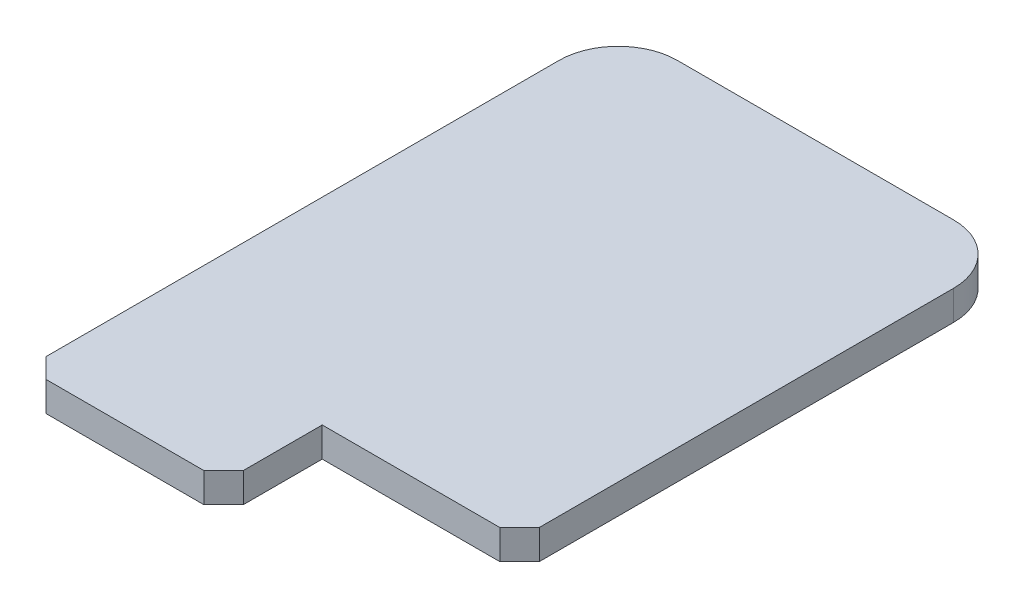
ISO-10303-21;
HEADER;
FILE_DESCRIPTION(('STEP AP214'),'2;1');
FILE_NAME('part.step','',(''),(''),'','','');
FILE_SCHEMA(('AUTOMOTIVE_DESIGN { 1 0 10303 214 1 1 1 1 }'));
ENDSEC;
DATA;
#1=APPLICATION_CONTEXT('core data for automotive mechanical design processes');
#2=APPLICATION_PROTOCOL_DEFINITION('international standard','automotive_design',2000,#1);
#3=PRODUCT_CONTEXT('',#1,'mechanical');
#4=PRODUCT('Part','Part','',(#3));
#5=PRODUCT_RELATED_PRODUCT_CATEGORY('part','',(#4));
#6=PRODUCT_DEFINITION_FORMATION('','',#4);
#7=PRODUCT_DEFINITION_CONTEXT('part definition',#1,'design');
#8=PRODUCT_DEFINITION('design','',#6,#7);
#9=PRODUCT_DEFINITION_SHAPE('','',#8);
#10=(LENGTH_UNIT() NAMED_UNIT(*) SI_UNIT(.MILLI.,.METRE.));
#11=(NAMED_UNIT(*) PLANE_ANGLE_UNIT() SI_UNIT($,.RADIAN.));
#12=(NAMED_UNIT(*) SI_UNIT($,.STERADIAN.) SOLID_ANGLE_UNIT());
#13=UNCERTAINTY_MEASURE_WITH_UNIT(LENGTH_MEASURE(1.E-05),#10,'distance_accuracy_value','');
#14=(GEOMETRIC_REPRESENTATION_CONTEXT(3) GLOBAL_UNCERTAINTY_ASSIGNED_CONTEXT((#13)) GLOBAL_UNIT_ASSIGNED_CONTEXT((#10,
#11,#12)) REPRESENTATION_CONTEXT('',''));
#15=CARTESIAN_POINT('',(0.,0.,0.));
#16=DIRECTION('',(0.,0.,1.));
#17=DIRECTION('',(1.,0.,0.));
#18=AXIS2_PLACEMENT_3D('',#15,#16,#17);
#19=CARTESIAN_POINT('',(-10.,1.5,0.));
#20=DIRECTION('',(0.,0.,-1.));
#21=DIRECTION('',(-1.,0.,0.));
#22=AXIS2_PLACEMENT_3D('',#19,#20,#21);
#23=PLANE('',#22);
#24=DIRECTION('',(1.,0.,0.));
#25=VECTOR('',#24,1.);
#26=CARTESIAN_POINT('',(-10.,0.,0.));
#27=LINE('',#26,#25);
#28=CARTESIAN_POINT('',(-9.,0.,0.));
#29=VERTEX_POINT('',#28);
#30=CARTESIAN_POINT('',(-1.00000000000001,0.,0.));
#31=VERTEX_POINT('',#30);
#32=EDGE_CURVE('E149',#29,#31,#27,.T.);
#33=ORIENTED_EDGE('',*,*,#32,.T.);
#34=DIRECTION('',(0.,1.,0.));
#35=VECTOR('',#34,1.);
#36=CARTESIAN_POINT('',(-1.00000000000001,1.5,0.));
#37=LINE('',#36,#35);
#38=CARTESIAN_POINT('',(-1.00000000000001,1.5,0.));
#39=VERTEX_POINT('',#38);
#40=EDGE_CURVE('E41',#31,#39,#37,.T.);
#41=ORIENTED_EDGE('',*,*,#40,.T.);
#42=DIRECTION('',(1.,0.,0.));
#43=VECTOR('',#42,1.);
#44=CARTESIAN_POINT('',(-10.,1.5,0.));
#45=LINE('',#44,#43);
#46=CARTESIAN_POINT('',(-9.,1.5,0.));
#47=VERTEX_POINT('',#46);
#48=EDGE_CURVE('E123',#47,#39,#45,.T.);
#49=ORIENTED_EDGE('',*,*,#48,.F.);
#50=DIRECTION('',(0.,-1.,0.));
#51=VECTOR('',#50,1.);
#52=CARTESIAN_POINT('',(-9.,1.5,0.));
#53=LINE('',#52,#51);
#54=EDGE_CURVE('E198',#47,#29,#53,.T.);
#55=ORIENTED_EDGE('',*,*,#54,.T.);
#56=EDGE_LOOP('',(#33,#41,#49,#55));
#57=FACE_BOUND('',#56,.T.);
#58=ADVANCED_FACE('F33',(#57),#23,.F.);
#59=CARTESIAN_POINT('',(0.,1.5,0.));
#60=DIRECTION('',(-1.,0.,0.));
#61=DIRECTION('',(0.,0.,1.));
#62=AXIS2_PLACEMENT_3D('',#59,#60,#61);
#63=PLANE('',#62);
#64=DIRECTION('',(0.,0.,-1.));
#65=VECTOR('',#64,1.);
#66=CARTESIAN_POINT('',(0.,1.5,0.));
#67=LINE('',#66,#65);
#68=CARTESIAN_POINT('',(0.,1.5,-1.));
#69=VERTEX_POINT('',#68);
#70=CARTESIAN_POINT('',(0.,1.5,-5.));
#71=VERTEX_POINT('',#70);
#72=EDGE_CURVE('E114',#69,#71,#67,.T.);
#73=ORIENTED_EDGE('',*,*,#72,.F.);
#74=DIRECTION('',(0.,-1.,0.));
#75=VECTOR('',#74,1.);
#76=CARTESIAN_POINT('',(0.,1.5,-1.));
#77=LINE('',#76,#75);
#78=CARTESIAN_POINT('',(0.,0.,-1.));
#79=VERTEX_POINT('',#78);
#80=EDGE_CURVE('E196',#69,#79,#77,.T.);
#81=ORIENTED_EDGE('',*,*,#80,.T.);
#82=DIRECTION('',(0.,0.,-1.));
#83=VECTOR('',#82,1.);
#84=CARTESIAN_POINT('',(0.,0.,0.));
#85=LINE('',#84,#83);
#86=CARTESIAN_POINT('',(0.,0.,-5.));
#87=VERTEX_POINT('',#86);
#88=EDGE_CURVE('E129',#79,#87,#85,.T.);
#89=ORIENTED_EDGE('',*,*,#88,.T.);
#90=DIRECTION('',(0.,-1.,0.));
#91=VECTOR('',#90,1.);
#92=CARTESIAN_POINT('',(0.,1.5,-5.));
#93=LINE('',#92,#91);
#94=EDGE_CURVE('E126',#71,#87,#93,.T.);
#95=ORIENTED_EDGE('',*,*,#94,.F.);
#96=EDGE_LOOP('',(#73,#81,#89,#95));
#97=FACE_BOUND('',#96,.T.);
#98=ADVANCED_FACE('F127',(#97),#63,.F.);
#99=CARTESIAN_POINT('',(0.,1.5,-5.));
#100=DIRECTION('',(0.,0.,-1.));
#101=DIRECTION('',(-1.,0.,0.));
#102=AXIS2_PLACEMENT_3D('',#99,#100,#101);
#103=PLANE('',#102);
#104=DIRECTION('',(1.,0.,0.));
#105=VECTOR('',#104,1.);
#106=CARTESIAN_POINT('',(0.,0.,-5.));
#107=LINE('',#106,#105);
#108=CARTESIAN_POINT('',(9.,0.,-5.));
#109=VERTEX_POINT('',#108);
#110=EDGE_CURVE('E152',#87,#109,#107,.T.);
#111=ORIENTED_EDGE('',*,*,#110,.T.);
#112=DIRECTION('',(0.,1.,0.));
#113=VECTOR('',#112,1.);
#114=CARTESIAN_POINT('',(9.,1.5,-5.));
#115=LINE('',#114,#113);
#116=CARTESIAN_POINT('',(9.,1.5,-5.));
#117=VERTEX_POINT('',#116);
#118=EDGE_CURVE('E138',#109,#117,#115,.T.);
#119=ORIENTED_EDGE('',*,*,#118,.T.);
#120=DIRECTION('',(1.,0.,0.));
#121=VECTOR('',#120,1.);
#122=CARTESIAN_POINT('',(0.,1.5,-5.));
#123=LINE('',#122,#121);
#124=EDGE_CURVE('E118',#71,#117,#123,.T.);
#125=ORIENTED_EDGE('',*,*,#124,.F.);
#126=ORIENTED_EDGE('',*,*,#94,.T.);
#127=EDGE_LOOP('',(#111,#119,#125,#126));
#128=FACE_BOUND('',#127,.T.);
#129=ADVANCED_FACE('F136',(#128),#103,.F.);
#130=CARTESIAN_POINT('',(10.,1.5,-5.));
#131=DIRECTION('',(-1.,0.,0.));
#132=DIRECTION('',(0.,0.,1.));
#133=AXIS2_PLACEMENT_3D('',#130,#131,#132);
#134=PLANE('',#133);
#135=DIRECTION('',(0.,0.,-1.));
#136=VECTOR('',#135,1.);
#137=CARTESIAN_POINT('',(10.,1.5,-5.));
#138=LINE('',#137,#136);
#139=CARTESIAN_POINT('',(10.,1.5,-6.));
#140=VERTEX_POINT('',#139);
#141=CARTESIAN_POINT('',(10.,1.5,-27.));
#142=VERTEX_POINT('',#141);
#143=EDGE_CURVE('E139',#140,#142,#138,.T.);
#144=ORIENTED_EDGE('',*,*,#143,.F.);
#145=DIRECTION('',(0.,-1.,0.));
#146=VECTOR('',#145,1.);
#147=CARTESIAN_POINT('',(10.,1.5,-6.));
#148=LINE('',#147,#146);
#149=CARTESIAN_POINT('',(10.,0.,-6.));
#150=VERTEX_POINT('',#149);
#151=EDGE_CURVE('E181',#140,#150,#148,.T.);
#152=ORIENTED_EDGE('',*,*,#151,.T.);
#153=DIRECTION('',(0.,0.,-1.));
#154=VECTOR('',#153,1.);
#155=CARTESIAN_POINT('',(10.,0.,-5.));
#156=LINE('',#155,#154);
#157=CARTESIAN_POINT('',(10.,0.,-27.));
#158=VERTEX_POINT('',#157);
#159=EDGE_CURVE('E154',#150,#158,#156,.T.);
#160=ORIENTED_EDGE('',*,*,#159,.T.);
#161=DIRECTION('',(0.,-1.,0.));
#162=VECTOR('',#161,1.);
#163=CARTESIAN_POINT('',(10.,1.5,-27.));
#164=LINE('',#163,#162);
#165=EDGE_CURVE('E171',#158,#142,#164,.F.);
#166=ORIENTED_EDGE('',*,*,#165,.T.);
#167=EDGE_LOOP('',(#144,#152,#160,#166));
#168=FACE_BOUND('',#167,.T.);
#169=ADVANCED_FACE('F251',(#168),#134,.F.);
#170=CARTESIAN_POINT('',(10.,1.5,-30.));
#171=DIRECTION('',(0.,0.,1.));
#172=DIRECTION('',(1.,0.,0.));
#173=AXIS2_PLACEMENT_3D('',#170,#171,#172);
#174=PLANE('',#173);
#175=DIRECTION('',(-1.,0.,0.));
#176=VECTOR('',#175,1.);
#177=CARTESIAN_POINT('',(10.,1.5,-30.));
#178=LINE('',#177,#176);
#179=CARTESIAN_POINT('',(7.,1.5,-30.));
#180=VERTEX_POINT('',#179);
#181=CARTESIAN_POINT('',(-7.,1.5,-30.));
#182=VERTEX_POINT('',#181);
#183=EDGE_CURVE('E141',#180,#182,#178,.T.);
#184=ORIENTED_EDGE('',*,*,#183,.F.);
#185=DIRECTION('',(0.,-1.,0.));
#186=VECTOR('',#185,1.);
#187=CARTESIAN_POINT('',(7.,1.5,-30.));
#188=LINE('',#187,#186);
#189=CARTESIAN_POINT('',(7.,0.,-30.));
#190=VERTEX_POINT('',#189);
#191=EDGE_CURVE('E163',#180,#190,#188,.T.);
#192=ORIENTED_EDGE('',*,*,#191,.T.);
#193=DIRECTION('',(-1.,0.,0.));
#194=VECTOR('',#193,1.);
#195=CARTESIAN_POINT('',(10.,0.,-30.));
#196=LINE('',#195,#194);
#197=CARTESIAN_POINT('',(-7.,0.,-30.));
#198=VERTEX_POINT('',#197);
#199=EDGE_CURVE('E156',#190,#198,#196,.T.);
#200=ORIENTED_EDGE('',*,*,#199,.T.);
#201=DIRECTION('',(0.,-1.,0.));
#202=VECTOR('',#201,1.);
#203=CARTESIAN_POINT('',(-7.,1.5,-30.));
#204=LINE('',#203,#202);
#205=EDGE_CURVE('E133',#198,#182,#204,.F.);
#206=ORIENTED_EDGE('',*,*,#205,.T.);
#207=EDGE_LOOP('',(#184,#192,#200,#206));
#208=FACE_BOUND('',#207,.T.);
#209=ADVANCED_FACE('F245',(#208),#174,.F.);
#210=CARTESIAN_POINT('',(-10.,1.5,-30.));
#211=DIRECTION('',(1.,0.,0.));
#212=DIRECTION('',(0.,0.,-1.));
#213=AXIS2_PLACEMENT_3D('',#210,#211,#212);
#214=PLANE('',#213);
#215=DIRECTION('',(0.,0.,1.));
#216=VECTOR('',#215,1.);
#217=CARTESIAN_POINT('',(-10.,0.,-30.));
#218=LINE('',#217,#216);
#219=CARTESIAN_POINT('',(-10.,0.,-27.));
#220=VERTEX_POINT('',#219);
#221=CARTESIAN_POINT('',(-10.,0.,-1.00000000000001));
#222=VERTEX_POINT('',#221);
#223=EDGE_CURVE('E159',#220,#222,#218,.T.);
#224=ORIENTED_EDGE('',*,*,#223,.T.);
#225=DIRECTION('',(0.,1.,0.));
#226=VECTOR('',#225,1.);
#227=CARTESIAN_POINT('',(-10.,1.5,-1.00000000000001));
#228=LINE('',#227,#226);
#229=CARTESIAN_POINT('',(-10.,1.5,-1.00000000000001));
#230=VERTEX_POINT('',#229);
#231=EDGE_CURVE('E11',#222,#230,#228,.T.);
#232=ORIENTED_EDGE('',*,*,#231,.T.);
#233=DIRECTION('',(0.,0.,1.));
#234=VECTOR('',#233,1.);
#235=CARTESIAN_POINT('',(-10.,1.5,-30.));
#236=LINE('',#235,#234);
#237=CARTESIAN_POINT('',(-10.,1.5,-27.));
#238=VERTEX_POINT('',#237);
#239=EDGE_CURVE('E134',#238,#230,#236,.T.);
#240=ORIENTED_EDGE('',*,*,#239,.F.);
#241=DIRECTION('',(0.,-1.,0.));
#242=VECTOR('',#241,1.);
#243=CARTESIAN_POINT('',(-10.,1.5,-27.));
#244=LINE('',#243,#242);
#245=EDGE_CURVE('E178',#238,#220,#244,.T.);
#246=ORIENTED_EDGE('',*,*,#245,.T.);
#247=EDGE_LOOP('',(#224,#232,#240,#246));
#248=FACE_BOUND('',#247,.T.);
#249=ADVANCED_FACE('F241',(#248),#214,.F.);
#250=CARTESIAN_POINT('',(0.,1.5,0.));
#251=DIRECTION('',(0.,1.,0.));
#252=DIRECTION('',(0.,0.,1.));
#253=AXIS2_PLACEMENT_3D('',#250,#251,#252);
#254=PLANE('',#253);
#255=ORIENTED_EDGE('',*,*,#124,.T.);
#256=DIRECTION('',(-0.70710678118655,0.,0.707106781186545));
#257=VECTOR('',#256,1.);
#258=CARTESIAN_POINT('',(1.99999999999997,1.5,1.99999999999998));
#259=LINE('',#258,#257);
#260=EDGE_CURVE('E194',#117,#140,#259,.F.);
#261=ORIENTED_EDGE('',*,*,#260,.T.);
#262=ORIENTED_EDGE('',*,*,#143,.T.);
#263=CARTESIAN_POINT('',(7.,1.5,-27.));
#264=DIRECTION('',(0.,1.,0.));
#265=DIRECTION('',(0.,0.,1.));
#266=AXIS2_PLACEMENT_3D('',#263,#264,#265);
#267=CIRCLE('',#266,3.);
#268=EDGE_CURVE('E176',#142,#180,#267,.T.);
#269=ORIENTED_EDGE('',*,*,#268,.T.);
#270=ORIENTED_EDGE('',*,*,#183,.T.);
#271=CARTESIAN_POINT('',(-7.,1.5,-27.));
#272=DIRECTION('',(0.,1.,0.));
#273=DIRECTION('',(0.,0.,1.));
#274=AXIS2_PLACEMENT_3D('',#271,#272,#273);
#275=CIRCLE('',#274,3.);
#276=EDGE_CURVE('E174',#182,#238,#275,.T.);
#277=ORIENTED_EDGE('',*,*,#276,.T.);
#278=ORIENTED_EDGE('',*,*,#239,.T.);
#279=DIRECTION('',(-0.707106781186546,0.,-0.707106781186549));
#280=VECTOR('',#279,1.);
#281=CARTESIAN_POINT('',(-4.50000000000001,1.5,4.5));
#282=LINE('',#281,#280);
#283=EDGE_CURVE('E191',#230,#47,#282,.F.);
#284=ORIENTED_EDGE('',*,*,#283,.T.);
#285=ORIENTED_EDGE('',*,*,#48,.T.);
#286=DIRECTION('',(-0.707106781186549,0.,0.707106781186546));
#287=VECTOR('',#286,1.);
#288=CARTESIAN_POINT('',(-0.500000000000002,1.5,-0.500000000000004));
#289=LINE('',#288,#287);
#290=EDGE_CURVE('E48',#39,#69,#289,.F.);
#291=ORIENTED_EDGE('',*,*,#290,.T.);
#292=ORIENTED_EDGE('',*,*,#72,.T.);
#293=EDGE_LOOP('',(#255,#261,#262,#269,#270,#277,#278,#284,#285,#291,#292));
#294=FACE_BOUND('',#293,.T.);
#295=ADVANCED_FACE('F116',(#294),#254,.T.);
#296=CARTESIAN_POINT('',(0.,0.,0.));
#297=DIRECTION('',(0.,1.,0.));
#298=DIRECTION('',(0.,0.,1.));
#299=AXIS2_PLACEMENT_3D('',#296,#297,#298);
#300=PLANE('',#299);
#301=ORIENTED_EDGE('',*,*,#159,.F.);
#302=DIRECTION('',(0.70710678118655,0.,-0.707106781186545));
#303=VECTOR('',#302,1.);
#304=CARTESIAN_POINT('',(10.,0.,-6.));
#305=LINE('',#304,#303);
#306=EDGE_CURVE('E188',#150,#109,#305,.F.);
#307=ORIENTED_EDGE('',*,*,#306,.T.);
#308=ORIENTED_EDGE('',*,*,#110,.F.);
#309=ORIENTED_EDGE('',*,*,#88,.F.);
#310=DIRECTION('',(0.707106781186549,0.,-0.707106781186546));
#311=VECTOR('',#310,1.);
#312=CARTESIAN_POINT('',(0.,0.,-1.));
#313=LINE('',#312,#311);
#314=EDGE_CURVE('E186',#79,#31,#313,.F.);
#315=ORIENTED_EDGE('',*,*,#314,.T.);
#316=ORIENTED_EDGE('',*,*,#32,.F.);
#317=DIRECTION('',(0.707106781186546,0.,0.707106781186549));
#318=VECTOR('',#317,1.);
#319=CARTESIAN_POINT('',(-9.,0.,0.));
#320=LINE('',#319,#318);
#321=EDGE_CURVE('E184',#29,#222,#320,.F.);
#322=ORIENTED_EDGE('',*,*,#321,.T.);
#323=ORIENTED_EDGE('',*,*,#223,.F.);
#324=CARTESIAN_POINT('',(-7.,0.,-27.));
#325=DIRECTION('',(0.,1.,0.));
#326=DIRECTION('',(0.,0.,1.));
#327=AXIS2_PLACEMENT_3D('',#324,#325,#326);
#328=CIRCLE('',#327,3.);
#329=EDGE_CURVE('E166',#220,#198,#328,.F.);
#330=ORIENTED_EDGE('',*,*,#329,.T.);
#331=ORIENTED_EDGE('',*,*,#199,.F.);
#332=CARTESIAN_POINT('',(7.,0.,-27.));
#333=DIRECTION('',(0.,1.,0.));
#334=DIRECTION('',(0.,0.,1.));
#335=AXIS2_PLACEMENT_3D('',#332,#333,#334);
#336=CIRCLE('',#335,3.);
#337=EDGE_CURVE('E168',#190,#158,#336,.F.);
#338=ORIENTED_EDGE('',*,*,#337,.T.);
#339=EDGE_LOOP('',(#301,#307,#308,#309,#315,#316,#322,#323,#330,#331,#338));
#340=FACE_BOUND('',#339,.T.);
#341=ADVANCED_FACE('F206',(#340),#300,.F.);
#342=CARTESIAN_POINT('',(7.,1.5,-27.));
#343=DIRECTION('',(0.,-1.,0.));
#344=DIRECTION('',(0.,0.,-1.));
#345=AXIS2_PLACEMENT_3D('',#342,#343,#344);
#346=CYLINDRICAL_SURFACE('',#345,3.);
#347=ORIENTED_EDGE('',*,*,#268,.F.);
#348=ORIENTED_EDGE('',*,*,#165,.F.);
#349=ORIENTED_EDGE('',*,*,#337,.F.);
#350=ORIENTED_EDGE('',*,*,#191,.F.);
#351=EDGE_LOOP('',(#347,#348,#349,#350));
#352=FACE_BOUND('',#351,.T.);
#353=ADVANCED_FACE('F227',(#352),#346,.T.);
#354=CARTESIAN_POINT('',(-7.,1.5,-27.));
#355=DIRECTION('',(0.,-1.,0.));
#356=DIRECTION('',(0.,0.,-1.));
#357=AXIS2_PLACEMENT_3D('',#354,#355,#356);
#358=CYLINDRICAL_SURFACE('',#357,3.);
#359=ORIENTED_EDGE('',*,*,#276,.F.);
#360=ORIENTED_EDGE('',*,*,#205,.F.);
#361=ORIENTED_EDGE('',*,*,#329,.F.);
#362=ORIENTED_EDGE('',*,*,#245,.F.);
#363=EDGE_LOOP('',(#359,#360,#361,#362));
#364=FACE_BOUND('',#363,.T.);
#365=ADVANCED_FACE('F216',(#364),#358,.T.);
#366=CARTESIAN_POINT('',(10.,1.5,-6.));
#367=DIRECTION('',(-0.707106781186545,0.,-0.70710678118655));
#368=DIRECTION('',(0.,-1.,0.));
#369=AXIS2_PLACEMENT_3D('',#366,#367,#368);
#370=PLANE('',#369);
#371=ORIENTED_EDGE('',*,*,#260,.F.);
#372=ORIENTED_EDGE('',*,*,#118,.F.);
#373=ORIENTED_EDGE('',*,*,#306,.F.);
#374=ORIENTED_EDGE('',*,*,#151,.F.);
#375=EDGE_LOOP('',(#371,#372,#373,#374));
#376=FACE_BOUND('',#375,.T.);
#377=ADVANCED_FACE('F211',(#376),#370,.F.);
#378=CARTESIAN_POINT('',(0.,1.5,-1.));
#379=DIRECTION('',(-0.707106781186546,0.,-0.707106781186549));
#380=DIRECTION('',(0.,-1.,0.));
#381=AXIS2_PLACEMENT_3D('',#378,#379,#380);
#382=PLANE('',#381);
#383=ORIENTED_EDGE('',*,*,#290,.F.);
#384=ORIENTED_EDGE('',*,*,#40,.F.);
#385=ORIENTED_EDGE('',*,*,#314,.F.);
#386=ORIENTED_EDGE('',*,*,#80,.F.);
#387=EDGE_LOOP('',(#383,#384,#385,#386));
#388=FACE_BOUND('',#387,.T.);
#389=ADVANCED_FACE('F209',(#388),#382,.F.);
#390=CARTESIAN_POINT('',(-9.,1.5,0.));
#391=DIRECTION('',(0.707106781186549,0.,-0.707106781186546));
#392=DIRECTION('',(0.,-1.,0.));
#393=AXIS2_PLACEMENT_3D('',#390,#391,#392);
#394=PLANE('',#393);
#395=ORIENTED_EDGE('',*,*,#283,.F.);
#396=ORIENTED_EDGE('',*,*,#231,.F.);
#397=ORIENTED_EDGE('',*,*,#321,.F.);
#398=ORIENTED_EDGE('',*,*,#54,.F.);
#399=EDGE_LOOP('',(#395,#396,#397,#398));
#400=FACE_BOUND('',#399,.T.);
#401=ADVANCED_FACE('F35',(#400),#394,.F.);
#402=CLOSED_SHELL('',(#58,#98,#129,#169,#209,#249,#295,#341,#353,#365,#377,#389,#401));
#403=MANIFOLD_SOLID_BREP('B2',#402);
#404=ADVANCED_BREP_SHAPE_REPRESENTATION('',(#18,#403),#14);
#405=SHAPE_DEFINITION_REPRESENTATION(#9,#404);
ENDSEC;
END-ISO-10303-21;
